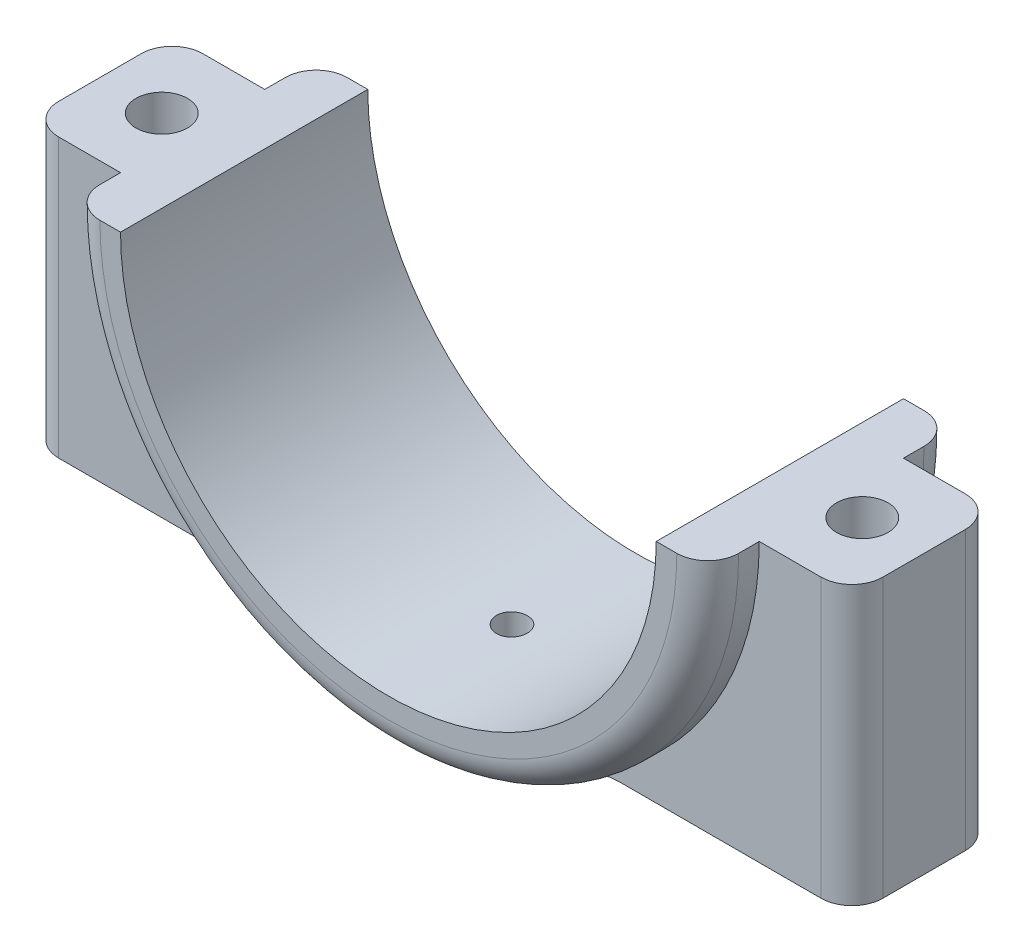
ISO-10303-21;
HEADER;
FILE_DESCRIPTION(('STEP AP214'),'2;1');
FILE_NAME('part.step','',(''),(''),'','','');
FILE_SCHEMA(('AUTOMOTIVE_DESIGN { 1 0 10303 214 1 1 1 1 }'));
ENDSEC;
DATA;
#1=APPLICATION_CONTEXT('core data for automotive mechanical design processes');
#2=APPLICATION_PROTOCOL_DEFINITION('international standard','automotive_design',2000,#1);
#3=PRODUCT_CONTEXT('',#1,'mechanical');
#4=PRODUCT('Part','Part','',(#3));
#5=PRODUCT_RELATED_PRODUCT_CATEGORY('part','',(#4));
#6=PRODUCT_DEFINITION_FORMATION('','',#4);
#7=PRODUCT_DEFINITION_CONTEXT('part definition',#1,'design');
#8=PRODUCT_DEFINITION('design','',#6,#7);
#9=PRODUCT_DEFINITION_SHAPE('','',#8);
#10=(LENGTH_UNIT() NAMED_UNIT(*) SI_UNIT(.MILLI.,.METRE.));
#11=(NAMED_UNIT(*) PLANE_ANGLE_UNIT() SI_UNIT($,.RADIAN.));
#12=(NAMED_UNIT(*) SI_UNIT($,.STERADIAN.) SOLID_ANGLE_UNIT());
#13=UNCERTAINTY_MEASURE_WITH_UNIT(LENGTH_MEASURE(1.E-05),#10,'distance_accuracy_value','');
#14=(GEOMETRIC_REPRESENTATION_CONTEXT(3) GLOBAL_UNCERTAINTY_ASSIGNED_CONTEXT((#13)) GLOBAL_UNIT_ASSIGNED_CONTEXT((#10,
#11,#12)) REPRESENTATION_CONTEXT('',''));
#15=CARTESIAN_POINT('',(0.,0.,0.));
#16=DIRECTION('',(0.,0.,1.));
#17=DIRECTION('',(1.,0.,0.));
#18=AXIS2_PLACEMENT_3D('',#15,#16,#17);
#19=CARTESIAN_POINT('',(15.2315462117278,-27.,12.));
#20=DIRECTION('',(0.,1.,0.));
#21=DIRECTION('',(-1.,0.,0.));
#22=AXIS2_PLACEMENT_3D('',#19,#20,#21);
#23=PLANE('',#22);
#24=DIRECTION('',(1.,0.,0.));
#25=VECTOR('',#24,1.);
#26=CARTESIAN_POINT('',(15.2315462117278,-27.,7.));
#27=LINE('',#26,#25);
#28=CARTESIAN_POINT('',(17.6635217326557,-27.,7.));
#29=VERTEX_POINT('',#28);
#30=CARTESIAN_POINT('',(37.,-27.,7.));
#31=VERTEX_POINT('',#30);
#32=EDGE_CURVE('E243',#29,#31,#27,.T.);
#33=ORIENTED_EDGE('',*,*,#32,.F.);
#34=DIRECTION('',(0.,0.,1.));
#35=VECTOR('',#34,1.);
#36=CARTESIAN_POINT('',(17.6635217326557,-27.,-7.));
#37=LINE('',#36,#35);
#38=CARTESIAN_POINT('',(17.6635217326557,-27.,-7.));
#39=VERTEX_POINT('',#38);
#40=EDGE_CURVE('E386',#29,#39,#37,.F.);
#41=ORIENTED_EDGE('',*,*,#40,.T.);
#42=DIRECTION('',(1.,0.,0.));
#43=VECTOR('',#42,1.);
#44=CARTESIAN_POINT('',(15.2315462117278,-27.,-7.));
#45=LINE('',#44,#43);
#46=CARTESIAN_POINT('',(37.,-27.,-7.));
#47=VERTEX_POINT('',#46);
#48=EDGE_CURVE('E193',#39,#47,#45,.T.);
#49=ORIENTED_EDGE('',*,*,#48,.T.);
#50=CARTESIAN_POINT('',(37.,-27.,-4.));
#51=DIRECTION('',(0.,1.,0.));
#52=DIRECTION('',(-1.,0.,0.));
#53=AXIS2_PLACEMENT_3D('',#50,#51,#52);
#54=CIRCLE('',#53,3.);
#55=CARTESIAN_POINT('',(40.,-27.,-4.));
#56=VERTEX_POINT('',#55);
#57=EDGE_CURVE('E366',#47,#56,#54,.F.);
#58=ORIENTED_EDGE('',*,*,#57,.T.);
#59=DIRECTION('',(0.,0.,-1.));
#60=VECTOR('',#59,1.);
#61=CARTESIAN_POINT('',(40.,-27.,12.));
#62=LINE('',#61,#60);
#63=CARTESIAN_POINT('',(40.,-27.,4.));
#64=VERTEX_POINT('',#63);
#65=EDGE_CURVE('E286',#64,#56,#62,.T.);
#66=ORIENTED_EDGE('',*,*,#65,.F.);
#67=CARTESIAN_POINT('',(37.,-27.,4.));
#68=DIRECTION('',(0.,1.,0.));
#69=DIRECTION('',(-1.,0.,0.));
#70=AXIS2_PLACEMENT_3D('',#67,#68,#69);
#71=CIRCLE('',#70,3.);
#72=EDGE_CURVE('E362',#64,#31,#71,.F.);
#73=ORIENTED_EDGE('',*,*,#72,.T.);
#74=EDGE_LOOP('',(#33,#41,#49,#58,#66,#73));
#75=FACE_BOUND('',#74,.T.);
#76=CARTESIAN_POINT('',(34.,-27.,0.));
#77=DIRECTION('',(0.,1.,0.));
#78=DIRECTION('',(-1.,0.,0.));
#79=AXIS2_PLACEMENT_3D('',#76,#77,#78);
#80=CIRCLE('',#79,2.5);
#81=CARTESIAN_POINT('',(31.5,-27.,0.));
#82=VERTEX_POINT('',#81);
#83=EDGE_CURVE('E414',#82,#82,#80,.F.);
#84=ORIENTED_EDGE('',*,*,#83,.F.);
#85=EDGE_LOOP('',(#84));
#86=FACE_BOUND('',#85,.T.);
#87=ADVANCED_FACE('F41',(#75,#86),#23,.F.);
#88=CARTESIAN_POINT('',(26.,0.,12.));
#89=DIRECTION('',(0.,-1.,0.));
#90=DIRECTION('',(0.,0.,-1.));
#91=AXIS2_PLACEMENT_3D('',#88,#89,#90);
#92=PLANE('',#91);
#93=DIRECTION('',(0.,0.,-1.));
#94=VECTOR('',#93,1.);
#95=CARTESIAN_POINT('',(31.,0.,-7.));
#96=LINE('',#95,#94);
#97=CARTESIAN_POINT('',(31.,0.,-7.));
#98=VERTEX_POINT('',#97);
#99=CARTESIAN_POINT('',(31.,0.,-9.));
#100=VERTEX_POINT('',#99);
#101=EDGE_CURVE('E186',#98,#100,#96,.T.);
#102=ORIENTED_EDGE('',*,*,#101,.T.);
#103=CARTESIAN_POINT('',(28.,0.,-9.));
#104=DIRECTION('',(0.,-1.,0.));
#105=DIRECTION('',(0.,0.,-1.));
#106=AXIS2_PLACEMENT_3D('',#103,#104,#105);
#107=CIRCLE('',#106,3.);
#108=CARTESIAN_POINT('',(28.,0.,-12.));
#109=VERTEX_POINT('',#108);
#110=EDGE_CURVE('E314',#100,#109,#107,.F.);
#111=ORIENTED_EDGE('',*,*,#110,.T.);
#112=DIRECTION('',(-1.,0.,0.));
#113=VECTOR('',#112,1.);
#114=CARTESIAN_POINT('',(26.,0.,-12.));
#115=LINE('',#114,#113);
#116=CARTESIAN_POINT('',(26.,0.,-12.));
#117=VERTEX_POINT('',#116);
#118=EDGE_CURVE('E237',#109,#117,#115,.T.);
#119=ORIENTED_EDGE('',*,*,#118,.T.);
#120=DIRECTION('',(0.,0.,-1.));
#121=VECTOR('',#120,1.);
#122=CARTESIAN_POINT('',(26.,0.,12.));
#123=LINE('',#122,#121);
#124=CARTESIAN_POINT('',(26.,0.,12.));
#125=VERTEX_POINT('',#124);
#126=EDGE_CURVE('E279',#125,#117,#123,.T.);
#127=ORIENTED_EDGE('',*,*,#126,.F.);
#128=DIRECTION('',(-1.,0.,0.));
#129=VECTOR('',#128,1.);
#130=CARTESIAN_POINT('',(26.,0.,12.));
#131=LINE('',#130,#129);
#132=CARTESIAN_POINT('',(28.,0.,12.));
#133=VERTEX_POINT('',#132);
#134=EDGE_CURVE('E276',#133,#125,#131,.T.);
#135=ORIENTED_EDGE('',*,*,#134,.F.);
#136=CARTESIAN_POINT('',(28.,0.,9.));
#137=DIRECTION('',(0.,-1.,0.));
#138=DIRECTION('',(0.,0.,-1.));
#139=AXIS2_PLACEMENT_3D('',#136,#137,#138);
#140=CIRCLE('',#139,3.);
#141=CARTESIAN_POINT('',(31.,0.,9.));
#142=VERTEX_POINT('',#141);
#143=EDGE_CURVE('E311',#133,#142,#140,.F.);
#144=ORIENTED_EDGE('',*,*,#143,.T.);
#145=DIRECTION('',(0.,0.,1.));
#146=VECTOR('',#145,1.);
#147=CARTESIAN_POINT('',(31.,0.,7.));
#148=LINE('',#147,#146);
#149=CARTESIAN_POINT('',(31.,0.,7.));
#150=VERTEX_POINT('',#149);
#151=EDGE_CURVE('E249',#150,#142,#148,.T.);
#152=ORIENTED_EDGE('',*,*,#151,.F.);
#153=DIRECTION('',(-1.,0.,0.));
#154=VECTOR('',#153,1.);
#155=CARTESIAN_POINT('',(40.,0.,7.));
#156=LINE('',#155,#154);
#157=CARTESIAN_POINT('',(37.,0.,7.));
#158=VERTEX_POINT('',#157);
#159=EDGE_CURVE('E246',#158,#150,#156,.T.);
#160=ORIENTED_EDGE('',*,*,#159,.F.);
#161=CARTESIAN_POINT('',(37.,0.,4.));
#162=DIRECTION('',(0.,-1.,0.));
#163=DIRECTION('',(0.,0.,-1.));
#164=AXIS2_PLACEMENT_3D('',#161,#162,#163);
#165=CIRCLE('',#164,3.);
#166=CARTESIAN_POINT('',(40.,0.,4.));
#167=VERTEX_POINT('',#166);
#168=EDGE_CURVE('E306',#158,#167,#165,.F.);
#169=ORIENTED_EDGE('',*,*,#168,.T.);
#170=DIRECTION('',(0.,0.,-1.));
#171=VECTOR('',#170,1.);
#172=CARTESIAN_POINT('',(40.,0.,12.));
#173=LINE('',#172,#171);
#174=CARTESIAN_POINT('',(40.,0.,-4.));
#175=VERTEX_POINT('',#174);
#176=EDGE_CURVE('E283',#167,#175,#173,.T.);
#177=ORIENTED_EDGE('',*,*,#176,.T.);
#178=CARTESIAN_POINT('',(37.,0.,-4.));
#179=DIRECTION('',(0.,-1.,0.));
#180=DIRECTION('',(0.,0.,-1.));
#181=AXIS2_PLACEMENT_3D('',#178,#179,#180);
#182=CIRCLE('',#181,3.);
#183=CARTESIAN_POINT('',(37.,0.,-7.));
#184=VERTEX_POINT('',#183);
#185=EDGE_CURVE('E188',#175,#184,#182,.F.);
#186=ORIENTED_EDGE('',*,*,#185,.T.);
#187=DIRECTION('',(-1.,0.,0.));
#188=VECTOR('',#187,1.);
#189=CARTESIAN_POINT('',(40.,0.,-7.));
#190=LINE('',#189,#188);
#191=EDGE_CURVE('E181',#184,#98,#190,.T.);
#192=ORIENTED_EDGE('',*,*,#191,.T.);
#193=EDGE_LOOP('',(#102,#111,#119,#127,#135,#144,#152,#160,#169,#177,#186,#192));
#194=FACE_BOUND('',#193,.T.);
#195=CARTESIAN_POINT('',(34.,0.,0.));
#196=DIRECTION('',(0.,-1.,0.));
#197=DIRECTION('',(0.,0.,1.));
#198=AXIS2_PLACEMENT_3D('',#195,#196,#197);
#199=CIRCLE('',#198,2.5);
#200=CARTESIAN_POINT('',(34.,0.,2.5));
#201=VERTEX_POINT('',#200);
#202=EDGE_CURVE('E410',#201,#201,#199,.T.);
#203=ORIENTED_EDGE('',*,*,#202,.T.);
#204=EDGE_LOOP('',(#203));
#205=FACE_BOUND('',#204,.T.);
#206=ADVANCED_FACE('F183',(#194,#205),#92,.F.);
#207=CARTESIAN_POINT('',(40.,0.,12.));
#208=DIRECTION('',(-1.,0.,0.));
#209=DIRECTION('',(0.,-1.,0.));
#210=AXIS2_PLACEMENT_3D('',#207,#208,#209);
#211=PLANE('',#210);
#212=ORIENTED_EDGE('',*,*,#65,.T.);
#213=DIRECTION('',(0.,1.,0.));
#214=VECTOR('',#213,1.);
#215=CARTESIAN_POINT('',(40.,0.,-4.));
#216=LINE('',#215,#214);
#217=EDGE_CURVE('E355',#56,#175,#216,.T.);
#218=ORIENTED_EDGE('',*,*,#217,.T.);
#219=ORIENTED_EDGE('',*,*,#176,.F.);
#220=DIRECTION('',(0.,1.,0.));
#221=VECTOR('',#220,1.);
#222=CARTESIAN_POINT('',(40.,-27.,4.));
#223=LINE('',#222,#221);
#224=EDGE_CURVE('E352',#167,#64,#223,.F.);
#225=ORIENTED_EDGE('',*,*,#224,.T.);
#226=EDGE_LOOP('',(#212,#218,#219,#225));
#227=FACE_BOUND('',#226,.T.);
#228=ADVANCED_FACE('F438',(#227),#211,.F.);
#229=CARTESIAN_POINT('',(-40.,0.,12.));
#230=DIRECTION('',(1.,0.,0.));
#231=DIRECTION('',(0.,1.,0.));
#232=AXIS2_PLACEMENT_3D('',#229,#230,#231);
#233=PLANE('',#232);
#234=DIRECTION('',(0.,0.,-1.));
#235=VECTOR('',#234,1.);
#236=CARTESIAN_POINT('',(-40.,0.,12.));
#237=LINE('',#236,#235);
#238=CARTESIAN_POINT('',(-40.,0.,4.));
#239=VERTEX_POINT('',#238);
#240=CARTESIAN_POINT('',(-40.,0.,-4.));
#241=VERTEX_POINT('',#240);
#242=EDGE_CURVE('E294',#239,#241,#237,.T.);
#243=ORIENTED_EDGE('',*,*,#242,.T.);
#244=DIRECTION('',(0.,-1.,0.));
#245=VECTOR('',#244,1.);
#246=CARTESIAN_POINT('',(-40.,-27.,-4.));
#247=LINE('',#246,#245);
#248=CARTESIAN_POINT('',(-40.,-27.,-4.));
#249=VERTEX_POINT('',#248);
#250=EDGE_CURVE('E339',#241,#249,#247,.T.);
#251=ORIENTED_EDGE('',*,*,#250,.T.);
#252=DIRECTION('',(0.,0.,-1.));
#253=VECTOR('',#252,1.);
#254=CARTESIAN_POINT('',(-40.,-27.,12.));
#255=LINE('',#254,#253);
#256=CARTESIAN_POINT('',(-40.,-27.,4.));
#257=VERTEX_POINT('',#256);
#258=EDGE_CURVE('E290',#257,#249,#255,.T.);
#259=ORIENTED_EDGE('',*,*,#258,.F.);
#260=DIRECTION('',(0.,-1.,0.));
#261=VECTOR('',#260,1.);
#262=CARTESIAN_POINT('',(-40.,0.,4.));
#263=LINE('',#262,#261);
#264=EDGE_CURVE('E336',#257,#239,#263,.F.);
#265=ORIENTED_EDGE('',*,*,#264,.T.);
#266=EDGE_LOOP('',(#243,#251,#259,#265));
#267=FACE_BOUND('',#266,.T.);
#268=ADVANCED_FACE('F507',(#267),#233,.F.);
#269=CARTESIAN_POINT('',(-40.,-27.,12.));
#270=DIRECTION('',(0.,1.,0.));
#271=DIRECTION('',(0.,0.,1.));
#272=AXIS2_PLACEMENT_3D('',#269,#270,#271);
#273=PLANE('',#272);
#274=CARTESIAN_POINT('',(-34.,-27.,0.));
#275=DIRECTION('',(0.,1.,0.));
#276=DIRECTION('',(0.,0.,1.));
#277=AXIS2_PLACEMENT_3D('',#274,#275,#276);
#278=CIRCLE('',#277,2.5);
#279=CARTESIAN_POINT('',(-34.,-27.,2.5));
#280=VERTEX_POINT('',#279);
#281=EDGE_CURVE('E204',#280,#280,#278,.T.);
#282=ORIENTED_EDGE('',*,*,#281,.T.);
#283=EDGE_LOOP('',(#282));
#284=FACE_BOUND('',#283,.T.);
#285=DIRECTION('',(1.,0.,0.));
#286=VECTOR('',#285,1.);
#287=CARTESIAN_POINT('',(-40.,-27.,-7.));
#288=LINE('',#287,#286);
#289=CARTESIAN_POINT('',(-37.,-27.,-7.));
#290=VERTEX_POINT('',#289);
#291=CARTESIAN_POINT('',(-17.6635217326557,-27.,-7.));
#292=VERTEX_POINT('',#291);
#293=EDGE_CURVE('E223',#290,#292,#288,.T.);
#294=ORIENTED_EDGE('',*,*,#293,.T.);
#295=DIRECTION('',(0.,0.,1.));
#296=VECTOR('',#295,1.);
#297=CARTESIAN_POINT('',(-17.6635217326557,-27.,7.));
#298=LINE('',#297,#296);
#299=CARTESIAN_POINT('',(-17.6635217326557,-27.,7.));
#300=VERTEX_POINT('',#299);
#301=EDGE_CURVE('E58',#292,#300,#298,.T.);
#302=ORIENTED_EDGE('',*,*,#301,.T.);
#303=DIRECTION('',(1.,0.,0.));
#304=VECTOR('',#303,1.);
#305=CARTESIAN_POINT('',(-40.,-27.,7.));
#306=LINE('',#305,#304);
#307=CARTESIAN_POINT('',(-37.,-27.,7.));
#308=VERTEX_POINT('',#307);
#309=EDGE_CURVE('E261',#308,#300,#306,.T.);
#310=ORIENTED_EDGE('',*,*,#309,.F.);
#311=CARTESIAN_POINT('',(-37.,-27.,4.));
#312=DIRECTION('',(0.,1.,0.));
#313=DIRECTION('',(0.,0.,1.));
#314=AXIS2_PLACEMENT_3D('',#311,#312,#313);
#315=CIRCLE('',#314,3.);
#316=EDGE_CURVE('E343',#308,#257,#315,.F.);
#317=ORIENTED_EDGE('',*,*,#316,.T.);
#318=ORIENTED_EDGE('',*,*,#258,.T.);
#319=CARTESIAN_POINT('',(-37.,-27.,-4.));
#320=DIRECTION('',(0.,1.,0.));
#321=DIRECTION('',(0.,0.,1.));
#322=AXIS2_PLACEMENT_3D('',#319,#320,#321);
#323=CIRCLE('',#322,3.);
#324=EDGE_CURVE('E346',#249,#290,#323,.F.);
#325=ORIENTED_EDGE('',*,*,#324,.T.);
#326=EDGE_LOOP('',(#294,#302,#310,#317,#318,#325));
#327=FACE_BOUND('',#326,.T.);
#328=ADVANCED_FACE('F552',(#284,#327),#273,.F.);
#329=CARTESIAN_POINT('',(0.,0.,12.));
#330=DIRECTION('',(0.,0.,-1.));
#331=DIRECTION('',(-1.,0.,0.));
#332=AXIS2_PLACEMENT_3D('',#329,#330,#331);
#333=CYLINDRICAL_SURFACE('',#332,26.);
#334=CARTESIAN_POINT('',(0.,-26.,1.5));
#335=CARTESIAN_POINT('',(-0.0841805329562701,-25.9999994232652,1.49999629135537));
#336=CARTESIAN_POINT('',(-0.168420319175694,-25.9995867966062,1.49288983050414));
#337=CARTESIAN_POINT('',(-0.334574733472835,-25.9979804159514,1.46464224952499));
#338=CARTESIAN_POINT('',(-0.41648652456529,-25.9967857482195,1.44348471171351));
#339=CARTESIAN_POINT('',(-0.575554082497933,-25.9937504620819,1.3877438977495));
#340=CARTESIAN_POINT('',(-0.652712299121072,-25.9919101797272,1.35316760524497));
#341=CARTESIAN_POINT('',(-0.800109182111021,-25.9877907595835,1.27158185774618));
#342=CARTESIAN_POINT('',(-0.870349448005788,-25.9855117236022,1.22457528611408));
#343=CARTESIAN_POINT('',(-1.00202817818701,-25.9807677473045,1.11939613718608));
#344=CARTESIAN_POINT('',(-1.06345650751792,-25.9783025978251,1.06121087986589));
#345=CARTESIAN_POINT('',(-1.17568107104939,-25.9734660237862,0.93535189256865));
#346=CARTESIAN_POINT('',(-1.22647686510814,-25.97109460311,0.86767776998642));
#347=CARTESIAN_POINT('',(-1.31602460276945,-25.9667113410899,0.724706068464687));
#348=CARTESIAN_POINT('',(-1.35476829307387,-25.9646997465544,0.649403312002849));
#349=CARTESIAN_POINT('',(-1.41905917809215,-25.9612656384867,0.493348262140617));
#350=CARTESIAN_POINT('',(-1.4446064975278,-25.9598431193869,0.412596020252655));
#351=CARTESIAN_POINT('',(-1.48175175962222,-25.9577495380438,0.248030470151698));
#352=CARTESIAN_POINT('',(-1.49336534790163,-25.9570776330248,0.164220704316902));
#353=CARTESIAN_POINT('',(-1.50236176890477,-25.9565585240932,-0.00416121027433815));
#354=CARTESIAN_POINT('',(-1.49974474270827,-25.9567113120047,-0.08873335146443));
#355=CARTESIAN_POINT('',(-1.48036722335147,-25.9578235763576,-0.25613282495506));
#356=CARTESIAN_POINT('',(-1.46362364948965,-25.9587820877828,-0.338962123070258));
#357=CARTESIAN_POINT('',(-1.41649455715691,-25.9613962548023,-0.500632490861998));
#358=CARTESIAN_POINT('',(-1.38610896682727,-25.9630519140687,-0.579473539528182));
#359=CARTESIAN_POINT('',(-1.31253912174372,-25.9668748958775,-0.730983822115165));
#360=CARTESIAN_POINT('',(-1.26934717602174,-25.9690425257286,-0.803649313413986));
#361=CARTESIAN_POINT('',(-1.17139626514012,-25.9736448466155,-0.940704852008894));
#362=CARTESIAN_POINT('',(-1.1166371898198,-25.9760795401945,-1.00509482048285));
#363=CARTESIAN_POINT('',(-0.997011060352408,-25.980945885219,-1.12386997241865));
#364=CARTESIAN_POINT('',(-0.932129360039576,-25.983377527028,-1.17824040627064));
#365=CARTESIAN_POINT('',(-0.79415113051681,-25.9879603013497,-1.27531938878724));
#366=CARTESIAN_POINT('',(-0.721054598813545,-25.9901114337774,-1.31802793391226));
#367=CARTESIAN_POINT('',(-0.568712832225706,-25.9938909128415,-1.39056948427948));
#368=CARTESIAN_POINT('',(-0.489467339345769,-25.9955192375275,-1.42040194892785));
#369=CARTESIAN_POINT('',(-0.32708106477655,-25.9980692970663,-1.46633473870553));
#370=CARTESIAN_POINT('',(-0.243940321874843,-25.9989910389534,-1.4824352005428));
#371=CARTESIAN_POINT('',(-0.0762516098963811,-26.0000231550308,-1.50042871546328));
#372=CARTESIAN_POINT('',(0.00829416374426765,-26.0001346940239,-1.50234216484281));
#373=CARTESIAN_POINT('',(0.176505521707528,-25.9995369306728,-1.49196060479445));
#374=CARTESIAN_POINT('',(0.260171109922139,-25.9988276319596,-1.47966565821983));
#375=CARTESIAN_POINT('',(0.424189805998086,-25.9966688089287,-1.44123319997977));
#376=CARTESIAN_POINT('',(0.504545109369873,-25.9952197840552,-1.4151050277126));
#377=CARTESIAN_POINT('',(0.659729954588885,-25.9917445779571,-1.34975727906617));
#378=CARTESIAN_POINT('',(0.734559454047617,-25.9897183923058,-1.31053760227459));
#379=CARTESIAN_POINT('',(0.876662062309669,-25.9853137409144,-1.22006810277243));
#380=CARTESIAN_POINT('',(0.943926472874837,-25.9829348768066,-1.16880463721188));
#381=CARTESIAN_POINT('',(1.06890199379619,-25.9780939964604,-1.0557226302678));
#382=CARTESIAN_POINT('',(1.1266130235903,-25.975631979521,-0.993903999883256));
#383=CARTESIAN_POINT('',(1.23091249723968,-25.9708989291175,-0.861378573816093));
#384=CARTESIAN_POINT('',(1.27748772359287,-25.9686281246603,-0.790661366473544));
#385=CARTESIAN_POINT('',(1.35810311139776,-25.9645372030828,-0.642398628960878));
#386=CARTESIAN_POINT('',(1.39214334084632,-25.9627170835177,-0.564853135834047));
#387=CARTESIAN_POINT('',(1.44669950357392,-25.9597344312014,-0.405183619903971));
#388=CARTESIAN_POINT('',(1.46722379982346,-25.9585714918839,-0.323062462474262));
#389=CARTESIAN_POINT('',(1.49419281569377,-25.9570332107582,-0.156532814129689));
#390=CARTESIAN_POINT('',(1.5006376504293,-25.9566578625106,-0.0721243419217995));
#391=CARTESIAN_POINT('',(1.49926370789809,-25.9567372474329,0.0964524153222931));
#392=CARTESIAN_POINT('',(1.49146571519202,-25.9571907710306,0.1806208711181));
#393=CARTESIAN_POINT('',(1.4618705150865,-25.9588742293202,0.346451335438427));
#394=CARTESIAN_POINT('',(1.44007328173983,-25.9601041654512,0.428113339317009));
#395=CARTESIAN_POINT('',(1.38310286535193,-25.9632015502146,0.586616399328704));
#396=CARTESIAN_POINT('',(1.3479296890203,-25.9650689985273,0.663457457880063));
#397=CARTESIAN_POINT('',(1.26520891598216,-25.9692309066721,0.81014582355331));
#398=CARTESIAN_POINT('',(1.21766166405776,-25.9715253546061,0.879993325463417));
#399=CARTESIAN_POINT('',(1.11146632504135,-25.9762865607587,1.01081677185677));
#400=CARTESIAN_POINT('',(1.05280337946241,-25.978753546794,1.07178064628148));
#401=CARTESIAN_POINT('',(0.926058699105491,-25.9835799734581,1.18301532539504));
#402=CARTESIAN_POINT('',(0.857974658251974,-25.9859393875671,1.23328350434606));
#403=CARTESIAN_POINT('',(0.714252874919137,-25.990286914298,1.32173129007643));
#404=CARTESIAN_POINT('',(0.6386067443727,-25.9922746074246,1.35989727262968));
#405=CARTESIAN_POINT('',(0.48202442270714,-25.9956488541695,1.42294045445959));
#406=CARTESIAN_POINT('',(0.401094575199689,-25.9970361139297,1.44783327172928));
#407=CARTESIAN_POINT('',(0.266388680269865,-25.9986882490136,1.47712915643839));
#408=CARTESIAN_POINT('',(0.21348411139245,-25.999177979505,1.48569469045444));
#409=CARTESIAN_POINT('',(0.107061018201249,-25.9998340382248,1.49713128836058));
#410=CARTESIAN_POINT('',(0.0535424946001201,-26.0000003668285,1.50000235885992));
#411=CARTESIAN_POINT('',(0.,-26.,1.5));
#412=B_SPLINE_CURVE_WITH_KNOTS('',3,(#334,#335,#336,#337,#338,#339,#340,#341,#342,#343,#344,
#345,#346,#347,#348,#349,#350,#351,#352,#353,#354,#355,#356,#357,#358,#359,#360,#361,#362,#363,
#364,#365,#366,#367,#368,#369,#370,#371,#372,#373,#374,#375,#376,#377,#378,#379,#380,#381,#382,
#383,#384,#385,#386,#387,#388,#389,#390,#391,#392,#393,#394,#395,#396,#397,#398,#399,#400,#401,
#402,#403,#404,#405,#406,#407,#408,#409,#410,#411),.UNSPECIFIED.,.T.,.F.,(4,2,2,2,2,2,2,2,2,2,2,
2,2,2,2,2,2,2,2,2,2,2,2,2,2,2,2,2,2,2,2,2,2,2,2,2,2,2,4),(0.,0.25234614185918,0.504987652199548,
0.75749785389972,1.00994953393219,1.26268927979461,1.51543948594118,1.76836239669215,
2.02128291696969,2.27391917648434,2.52655293141283,2.77888453693176,3.0312174716116,
3.2837022550385,3.53618944313695,3.78904539555262,4.04190142471429,4.29476806883887,
4.54763219553833,4.80013271548406,5.05263211845455,5.30496126533429,5.5572923476322,
5.80991065317838,6.06253108890428,6.31544989707479,6.56836733325132,6.82112812960389,
7.07388685935692,7.32627703291011,7.57866767426323,7.83105818901302,8.08344167209274,
8.33616493015574,8.58895015906783,8.84201896258598,9.0947893295381,9.25529268043359,
9.41579584504143),.UNSPECIFIED.);
#413=CARTESIAN_POINT('',(0.,-26.,1.5));
#414=VERTEX_POINT('',#413);
#415=EDGE_CURVE('E403',#414,#414,#412,.T.);
#416=ORIENTED_EDGE('',*,*,#415,.T.);
#417=EDGE_LOOP('',(#416));
#418=FACE_BOUND('',#417,.T.);
#419=ORIENTED_EDGE('',*,*,#126,.T.);
#420=CARTESIAN_POINT('',(0.,0.,-12.));
#421=DIRECTION('',(0.,0.,-1.));
#422=DIRECTION('',(1.,0.,0.));
#423=AXIS2_PLACEMENT_3D('',#420,#421,#422);
#424=CIRCLE('',#423,26.);
#425=CARTESIAN_POINT('',(-26.,0.,-12.));
#426=VERTEX_POINT('',#425);
#427=EDGE_CURVE('E229',#117,#426,#424,.T.);
#428=ORIENTED_EDGE('',*,*,#427,.T.);
#429=DIRECTION('',(0.,0.,-1.));
#430=VECTOR('',#429,1.);
#431=CARTESIAN_POINT('',(-26.,0.,12.));
#432=LINE('',#431,#430);
#433=CARTESIAN_POINT('',(-26.,0.,12.));
#434=VERTEX_POINT('',#433);
#435=EDGE_CURVE('E298',#434,#426,#432,.T.);
#436=ORIENTED_EDGE('',*,*,#435,.F.);
#437=CARTESIAN_POINT('',(0.,0.,12.));
#438=DIRECTION('',(0.,0.,-1.));
#439=DIRECTION('',(1.,0.,0.));
#440=AXIS2_PLACEMENT_3D('',#437,#438,#439);
#441=CIRCLE('',#440,26.);
#442=EDGE_CURVE('E268',#125,#434,#441,.T.);
#443=ORIENTED_EDGE('',*,*,#442,.F.);
#444=EDGE_LOOP('',(#419,#428,#436,#443));
#445=FACE_BOUND('',#444,.T.);
#446=ADVANCED_FACE('F43',(#418,#445),#333,.F.);
#447=CARTESIAN_POINT('',(-40.,0.,12.));
#448=DIRECTION('',(0.,-1.,0.));
#449=DIRECTION('',(0.,0.,-1.));
#450=AXIS2_PLACEMENT_3D('',#447,#448,#449);
#451=PLANE('',#450);
#452=CARTESIAN_POINT('',(-34.,0.,0.));
#453=DIRECTION('',(0.,1.,0.));
#454=DIRECTION('',(0.,0.,1.));
#455=AXIS2_PLACEMENT_3D('',#452,#453,#454);
#456=CIRCLE('',#455,2.5);
#457=CARTESIAN_POINT('',(-34.,0.,2.5));
#458=VERTEX_POINT('',#457);
#459=EDGE_CURVE('E418',#458,#458,#456,.T.);
#460=ORIENTED_EDGE('',*,*,#459,.F.);
#461=EDGE_LOOP('',(#460));
#462=FACE_BOUND('',#461,.T.);
#463=DIRECTION('',(-1.,0.,0.));
#464=VECTOR('',#463,1.);
#465=CARTESIAN_POINT('',(-40.,0.,-12.));
#466=LINE('',#465,#464);
#467=CARTESIAN_POINT('',(-28.,0.,-12.));
#468=VERTEX_POINT('',#467);
#469=EDGE_CURVE('E233',#426,#468,#466,.T.);
#470=ORIENTED_EDGE('',*,*,#469,.T.);
#471=CARTESIAN_POINT('',(-28.,0.,-9.));
#472=DIRECTION('',(0.,-1.,0.));
#473=DIRECTION('',(0.,0.,-1.));
#474=AXIS2_PLACEMENT_3D('',#471,#472,#473);
#475=CIRCLE('',#474,3.);
#476=CARTESIAN_POINT('',(-31.,0.,-9.));
#477=VERTEX_POINT('',#476);
#478=EDGE_CURVE('E329',#468,#477,#475,.F.);
#479=ORIENTED_EDGE('',*,*,#478,.T.);
#480=DIRECTION('',(0.,0.,-1.));
#481=VECTOR('',#480,1.);
#482=CARTESIAN_POINT('',(-31.,0.,-7.));
#483=LINE('',#482,#481);
#484=CARTESIAN_POINT('',(-31.,0.,-7.));
#485=VERTEX_POINT('',#484);
#486=EDGE_CURVE('E226',#485,#477,#483,.T.);
#487=ORIENTED_EDGE('',*,*,#486,.F.);
#488=DIRECTION('',(-1.,0.,0.));
#489=VECTOR('',#488,1.);
#490=CARTESIAN_POINT('',(-31.,0.,-7.));
#491=LINE('',#490,#489);
#492=CARTESIAN_POINT('',(-37.,0.,-7.));
#493=VERTEX_POINT('',#492);
#494=EDGE_CURVE('E216',#485,#493,#491,.T.);
#495=ORIENTED_EDGE('',*,*,#494,.T.);
#496=CARTESIAN_POINT('',(-37.,0.,-4.));
#497=DIRECTION('',(0.,-1.,0.));
#498=DIRECTION('',(0.,0.,-1.));
#499=AXIS2_PLACEMENT_3D('',#496,#497,#498);
#500=CIRCLE('',#499,3.);
#501=EDGE_CURVE('E323',#493,#241,#500,.F.);
#502=ORIENTED_EDGE('',*,*,#501,.T.);
#503=ORIENTED_EDGE('',*,*,#242,.F.);
#504=CARTESIAN_POINT('',(-37.,0.,4.));
#505=DIRECTION('',(0.,-1.,0.));
#506=DIRECTION('',(0.,0.,-1.));
#507=AXIS2_PLACEMENT_3D('',#504,#505,#506);
#508=CIRCLE('',#507,3.);
#509=CARTESIAN_POINT('',(-37.,0.,7.));
#510=VERTEX_POINT('',#509);
#511=EDGE_CURVE('E320',#239,#510,#508,.F.);
#512=ORIENTED_EDGE('',*,*,#511,.T.);
#513=DIRECTION('',(-1.,0.,0.));
#514=VECTOR('',#513,1.);
#515=CARTESIAN_POINT('',(-31.,0.,7.));
#516=LINE('',#515,#514);
#517=CARTESIAN_POINT('',(-31.,0.,7.));
#518=VERTEX_POINT('',#517);
#519=EDGE_CURVE('E257',#518,#510,#516,.T.);
#520=ORIENTED_EDGE('',*,*,#519,.F.);
#521=DIRECTION('',(0.,0.,1.));
#522=VECTOR('',#521,1.);
#523=CARTESIAN_POINT('',(-31.,0.,7.));
#524=LINE('',#523,#522);
#525=CARTESIAN_POINT('',(-31.,0.,9.));
#526=VERTEX_POINT('',#525);
#527=EDGE_CURVE('E264',#518,#526,#524,.T.);
#528=ORIENTED_EDGE('',*,*,#527,.T.);
#529=CARTESIAN_POINT('',(-28.,0.,9.));
#530=DIRECTION('',(0.,-1.,0.));
#531=DIRECTION('',(0.,0.,-1.));
#532=AXIS2_PLACEMENT_3D('',#529,#530,#531);
#533=CIRCLE('',#532,3.);
#534=CARTESIAN_POINT('',(-28.,0.,12.));
#535=VERTEX_POINT('',#534);
#536=EDGE_CURVE('E326',#526,#535,#533,.F.);
#537=ORIENTED_EDGE('',*,*,#536,.T.);
#538=DIRECTION('',(-1.,0.,0.));
#539=VECTOR('',#538,1.);
#540=CARTESIAN_POINT('',(-40.,0.,12.));
#541=LINE('',#540,#539);
#542=EDGE_CURVE('E272',#434,#535,#541,.T.);
#543=ORIENTED_EDGE('',*,*,#542,.F.);
#544=ORIENTED_EDGE('',*,*,#435,.T.);
#545=EDGE_LOOP('',(#470,#479,#487,#495,#502,#503,#512,#520,#528,#537,#543,#544));
#546=FACE_BOUND('',#545,.T.);
#547=ADVANCED_FACE('F487',(#462,#546),#451,.F.);
#548=CARTESIAN_POINT('',(0.,0.,12.));
#549=DIRECTION('',(0.,0.,-1.));
#550=DIRECTION('',(-1.,0.,0.));
#551=AXIS2_PLACEMENT_3D('',#548,#549,#550);
#552=CYLINDRICAL_SURFACE('',#551,31.);
#553=CARTESIAN_POINT('',(0.,-31.,1.5));
#554=CARTESIAN_POINT('',(0.084202792347213,-30.9999995141353,1.49999628267172));
#555=CARTESIAN_POINT('',(0.16846538393463,-30.9996532552646,1.49288607826635));
#556=CARTESIAN_POINT('',(0.334666306521815,-30.9983052478194,1.46462276024114));
#557=CARTESIAN_POINT('',(0.416601776177143,-30.9973027258885,1.44345307816335));
#558=CARTESIAN_POINT('',(0.575716806083685,-30.9947556673606,1.3876781155977));
#559=CARTESIAN_POINT('',(0.652898757466731,-30.9932114059327,1.35307965512768));
#560=CARTESIAN_POINT('',(0.800338424727764,-30.989754816157,1.27143967078801));
#561=CARTESIAN_POINT('',(0.870597775269236,-30.9878425750182,1.22440109416827));
#562=CARTESIAN_POINT('',(1.00228593602068,-30.9838631189523,1.11916597512179));
#563=CARTESIAN_POINT('',(1.06370732933708,-30.9817957760503,1.06096015551694));
#564=CARTESIAN_POINT('',(1.175912884304,-30.9777402237292,0.935061211771744));
#565=CARTESIAN_POINT('',(1.22669661252568,-30.9757520175373,0.867367701245441));
#566=CARTESIAN_POINT('',(1.31620530239942,-30.9720780482436,0.724376578644087));
#567=CARTESIAN_POINT('',(1.35492453624809,-30.9703924289601,0.649075377098863));
#568=CARTESIAN_POINT('',(1.41916837372733,-30.9675152571658,0.493031678664971));
#569=CARTESIAN_POINT('',(1.44469307279057,-30.9663237010814,0.412289221136279));
#570=CARTESIAN_POINT('',(1.4818038666233,-30.9645701698934,0.247722648500629));
#571=CARTESIAN_POINT('',(1.49340096608462,-30.9640076977523,0.163901020401466));
#572=CARTESIAN_POINT('',(1.50236131211673,-30.9635742700934,-0.00450098116969173));
#573=CARTESIAN_POINT('',(1.49972466550413,-30.9637033093863,-0.0890813489429987));
#574=CARTESIAN_POINT('',(1.48030153781623,-30.9646378909971,-0.256525121490327));
#575=CARTESIAN_POINT('',(1.46352694576875,-30.9654428648991,-0.339389908978721));
#576=CARTESIAN_POINT('',(1.41632251806988,-30.9676376904524,-0.501126043058462));
#577=CARTESIAN_POINT('',(1.38589262744842,-30.9690275444582,-0.579997373572531));
#578=CARTESIAN_POINT('',(1.31222780980623,-30.9722361341312,-0.731546033020237));
#579=CARTESIAN_POINT('',(1.26898745946914,-30.9740550513761,-0.804220721786763));
#580=CARTESIAN_POINT('',(1.17093311263252,-30.977916568651,-0.941284248654876));
#581=CARTESIAN_POINT('',(1.11611903992714,-30.9799591701538,-1.00567303219439));
#582=CARTESIAN_POINT('',(0.996406111684985,-30.984040357555,-1.12440618960939));
#583=CARTESIAN_POINT('',(0.931496959677817,-30.9860789371772,-1.17874018280817));
#584=CARTESIAN_POINT('',(0.793472603518237,-30.9899202884063,-1.27574143375514));
#585=CARTESIAN_POINT('',(0.720357397428757,-30.9917230599576,-1.31840868874934));
#586=CARTESIAN_POINT('',(0.567990360982849,-30.994889688708,-1.39086428631198));
#587=CARTESIAN_POINT('',(0.488738359775541,-30.9962535336818,-1.42065227016414));
#588=CARTESIAN_POINT('',(0.326350089454761,-30.9983884188355,-1.46649698471219));
#589=CARTESIAN_POINT('',(0.243213847587594,-30.9991594631729,-1.48255381171107));
#590=CARTESIAN_POINT('',(0.0755071546222431,-31.0000213131359,-1.50046763138586));
#591=CARTESIAN_POINT('',(-0.00906175932715504,-31.0001128066215,-1.50233898302637));
#592=CARTESIAN_POINT('',(-0.177312416363826,-30.9996070690898,-1.49186619809194));
#593=CARTESIAN_POINT('',(-0.260994162194988,-30.9990098402033,-1.47952210549636));
#594=CARTESIAN_POINT('',(-0.425054850717316,-30.9971943722293,-1.44098071994186));
#595=CARTESIAN_POINT('',(-0.505435336299306,-30.995976426895,-1.41478997967182));
#596=CARTESIAN_POINT('',(-0.660659311632056,-30.9930566618195,-1.34930540074958));
#597=CARTESIAN_POINT('',(-0.735502771549003,-30.9913548394712,-1.31001149150302));
#598=CARTESIAN_POINT('',(-0.877594113082684,-30.9876570795363,-1.21939919981785));
#599=CARTESIAN_POINT('',(-0.944835847886493,-30.9856609068986,-1.1680711881436));
#600=CARTESIAN_POINT('',(-1.069753196027,-30.981600053942,-1.05486178073887));
#601=CARTESIAN_POINT('',(-1.12742875167054,-30.9795353732099,-0.992980321365624));
#602=CARTESIAN_POINT('',(-1.23162484946452,-30.9755682593618,-0.860358857446884));
#603=CARTESIAN_POINT('',(-1.27813610398032,-30.9736659621752,-0.789611551312447));
#604=CARTESIAN_POINT('',(-1.35861984062872,-30.9702402602838,-0.641303571456715));
#605=CARTESIAN_POINT('',(-1.39259237474057,-30.9687168540083,-0.563742925981769));
#606=CARTESIAN_POINT('',(-1.44701811019111,-30.9662216887023,-0.404044393253006));
#607=CARTESIAN_POINT('',(-1.4674772410086,-30.9652496877498,-0.32190853071367));
#608=CARTESIAN_POINT('',(-1.49431480708805,-30.9639662597759,-0.15536273788787));
#609=CARTESIAN_POINT('',(-1.50069331556864,-30.9636548293196,-0.0709528194287082));
#610=CARTESIAN_POINT('',(-1.49918787094173,-30.9637277479162,0.0976525227454576));
#611=CARTESIAN_POINT('',(-1.49131853063321,-30.964111384099,0.181848077635793));
#612=CARTESIAN_POINT('',(-1.46157096482106,-30.965529690569,0.34772120738356));
#613=CARTESIAN_POINT('',(-1.43969271249196,-30.9665643621029,0.429398777419027));
#614=CARTESIAN_POINT('',(-1.38255130267945,-30.9691679635807,0.587920601552681));
#615=CARTESIAN_POINT('',(-1.34728802998449,-30.9707368981232,0.664764814041113));
#616=CARTESIAN_POINT('',(-1.26438019462109,-30.9742321397003,0.811442855832791));
#617=CARTESIAN_POINT('',(-1.21673601854694,-30.9761584355758,0.881276903934388));
#618=CARTESIAN_POINT('',(-1.11036684002992,-30.9801535291738,1.01202505090426));
#619=CARTESIAN_POINT('',(-1.05163172409336,-30.9822224558552,1.07293091767903));
#620=CARTESIAN_POINT('',(-0.924753216326256,-30.9862687518801,1.18403664237983));
#621=CARTESIAN_POINT('',(-0.856607512051158,-30.9882460985599,1.23423386115272));
#622=CARTESIAN_POINT('',(-0.712791432696068,-30.9918877101885,1.3225193463518));
#623=CARTESIAN_POINT('',(-0.637114140312011,-30.9935516831903,1.36059634382881));
#624=CARTESIAN_POINT('',(-0.480489523188893,-30.9963746122402,1.42345862680518));
#625=CARTESIAN_POINT('',(-0.39954855684272,-30.9975341650531,1.44825962680302));
#626=CARTESIAN_POINT('',(-0.265086546175709,-30.9989105775063,1.47735387376696));
#627=CARTESIAN_POINT('',(-0.21243662515433,-30.9993173178012,1.48583534461829));
#628=CARTESIAN_POINT('',(-0.106532449423644,-30.9998621826533,1.49715958153611));
#629=CARTESIAN_POINT('',(-0.0532781951953069,-31.0000003074244,1.50000235208995));
#630=CARTESIAN_POINT('',(0.,-31.,1.5));
#631=B_SPLINE_CURVE_WITH_KNOTS('',3,(#553,#554,#555,#556,#557,#558,#559,#560,#561,#562,#563,
#564,#565,#566,#567,#568,#569,#570,#571,#572,#573,#574,#575,#576,#577,#578,#579,#580,#581,#582,
#583,#584,#585,#586,#587,#588,#589,#590,#591,#592,#593,#594,#595,#596,#597,#598,#599,#600,#601,
#602,#603,#604,#605,#606,#607,#608,#609,#610,#611,#612,#613,#614,#615,#616,#617,#618,#619,#620,
#621,#622,#623,#624,#625,#626,#627,#628,#629,#630),.UNSPECIFIED.,.T.,.F.,(4,2,2,2,2,2,2,2,2,2,2,
2,2,2,2,2,2,2,2,2,2,2,2,2,2,2,2,2,2,2,2,2,2,2,2,2,2,2,4),(0.,0.252413893052158,
0.505125773523082,0.757709477845073,1.01023339482665,1.26296801140084,1.51571292357749,
1.76857764807687,2.02144054364531,2.27410351151813,2.52676458329392,2.7792133964486,
3.03166322585737,3.28422008315802,3.53677860344184,3.78959643072694,4.04241431769071,
4.29523924573995,4.54806240059551,4.80062960603607,5.053196030093,5.30564303826078,
5.55809140652848,5.8107424680577,6.06339505325767,6.31625709848695,6.56911809546483,
6.82186806699016,7.0746167242234,7.32710630561693,7.57959637050037,7.83208860874094,
8.08457296384636,8.33728867346245,8.59006659325905,8.84307885505921,9.09579096598644,
9.25550262151986,9.41521414995216),.UNSPECIFIED.);
#632=CARTESIAN_POINT('',(0.,-31.,1.5));
#633=VERTEX_POINT('',#632);
#634=EDGE_CURVE('E377',#633,#633,#631,.T.);
#635=ORIENTED_EDGE('',*,*,#634,.T.);
#636=EDGE_LOOP('',(#635));
#637=FACE_BOUND('',#636,.T.);
#638=CARTESIAN_POINT('',(0.,0.,-7.));
#639=DIRECTION('',(0.,0.,-1.));
#640=DIRECTION('',(1.,0.,0.));
#641=AXIS2_PLACEMENT_3D('',#638,#639,#640);
#642=CIRCLE('',#641,31.);
#643=CARTESIAN_POINT('',(13.3553457003007,-27.9756097560976,-7.));
#644=VERTEX_POINT('',#643);
#645=EDGE_CURVE('E196',#98,#644,#642,.T.);
#646=ORIENTED_EDGE('',*,*,#645,.T.);
#647=DIRECTION('',(0.,0.,-1.));
#648=VECTOR('',#647,1.);
#649=CARTESIAN_POINT('',(13.3553457003007,-27.9756097560976,12.));
#650=LINE('',#649,#648);
#651=CARTESIAN_POINT('',(13.3553457003006,-27.9756097560976,7.));
#652=VERTEX_POINT('',#651);
#653=EDGE_CURVE('E457',#644,#652,#650,.F.);
#654=ORIENTED_EDGE('',*,*,#653,.T.);
#655=CARTESIAN_POINT('',(0.,0.,7.));
#656=DIRECTION('',(0.,0.,-1.));
#657=DIRECTION('',(1.,0.,0.));
#658=AXIS2_PLACEMENT_3D('',#655,#656,#657);
#659=CIRCLE('',#658,31.);
#660=EDGE_CURVE('E240',#150,#652,#659,.T.);
#661=ORIENTED_EDGE('',*,*,#660,.F.);
#662=ORIENTED_EDGE('',*,*,#151,.T.);
#663=CARTESIAN_POINT('',(0.,0.,9.));
#664=DIRECTION('',(0.,0.,1.));
#665=DIRECTION('',(1.,0.,0.));
#666=AXIS2_PLACEMENT_3D('',#663,#664,#665);
#667=CIRCLE('',#666,31.);
#668=EDGE_CURVE('E301',#142,#526,#667,.F.);
#669=ORIENTED_EDGE('',*,*,#668,.T.);
#670=ORIENTED_EDGE('',*,*,#527,.F.);
#671=CARTESIAN_POINT('',(0.,0.,7.));
#672=DIRECTION('',(0.,0.,-1.));
#673=DIRECTION('',(1.,0.,0.));
#674=AXIS2_PLACEMENT_3D('',#671,#672,#673);
#675=CIRCLE('',#674,31.);
#676=CARTESIAN_POINT('',(-13.3553457003006,-27.9756097560976,7.));
#677=VERTEX_POINT('',#676);
#678=EDGE_CURVE('E253',#677,#518,#675,.T.);
#679=ORIENTED_EDGE('',*,*,#678,.F.);
#680=DIRECTION('',(0.,0.,-1.));
#681=VECTOR('',#680,1.);
#682=CARTESIAN_POINT('',(-13.3553457003006,-27.9756097560976,12.));
#683=LINE('',#682,#681);
#684=CARTESIAN_POINT('',(-13.3553457003006,-27.9756097560976,-7.));
#685=VERTEX_POINT('',#684);
#686=EDGE_CURVE('E453',#677,#685,#683,.T.);
#687=ORIENTED_EDGE('',*,*,#686,.T.);
#688=CARTESIAN_POINT('',(0.,0.,-7.));
#689=DIRECTION('',(0.,0.,-1.));
#690=DIRECTION('',(1.,0.,0.));
#691=AXIS2_PLACEMENT_3D('',#688,#689,#690);
#692=CIRCLE('',#691,31.);
#693=EDGE_CURVE('E212',#685,#485,#692,.T.);
#694=ORIENTED_EDGE('',*,*,#693,.T.);
#695=ORIENTED_EDGE('',*,*,#486,.T.);
#696=CARTESIAN_POINT('',(0.,0.,-9.));
#697=DIRECTION('',(0.,0.,-1.));
#698=DIRECTION('',(-1.,0.,0.));
#699=AXIS2_PLACEMENT_3D('',#696,#697,#698);
#700=CIRCLE('',#699,31.);
#701=EDGE_CURVE('E210',#477,#100,#700,.F.);
#702=ORIENTED_EDGE('',*,*,#701,.T.);
#703=ORIENTED_EDGE('',*,*,#101,.F.);
#704=EDGE_LOOP('',(#646,#654,#661,#662,#669,#670,#679,#687,#694,#695,#702,#703));
#705=FACE_BOUND('',#704,.T.);
#706=ADVANCED_FACE('F207',(#637,#705),#552,.T.);
#707=CARTESIAN_POINT('',(0.,0.,12.));
#708=DIRECTION('',(0.,0.,1.));
#709=DIRECTION('',(1.,0.,0.));
#710=AXIS2_PLACEMENT_3D('',#707,#708,#709);
#711=PLANE('',#710);
#712=ORIENTED_EDGE('',*,*,#542,.T.);
#713=CARTESIAN_POINT('',(0.,0.,12.));
#714=DIRECTION('',(0.,0.,1.));
#715=DIRECTION('',(1.,0.,0.));
#716=AXIS2_PLACEMENT_3D('',#713,#714,#715);
#717=CIRCLE('',#716,28.);
#718=EDGE_CURVE('E332',#535,#133,#717,.T.);
#719=ORIENTED_EDGE('',*,*,#718,.T.);
#720=ORIENTED_EDGE('',*,*,#134,.T.);
#721=ORIENTED_EDGE('',*,*,#442,.T.);
#722=EDGE_LOOP('',(#712,#719,#720,#721));
#723=FACE_BOUND('',#722,.T.);
#724=ADVANCED_FACE('F483',(#723),#711,.T.);
#725=CARTESIAN_POINT('',(0.,0.,7.));
#726=DIRECTION('',(0.,0.,1.));
#727=DIRECTION('',(1.,0.,0.));
#728=AXIS2_PLACEMENT_3D('',#725,#726,#727);
#729=PLANE('',#728);
#730=ORIENTED_EDGE('',*,*,#519,.T.);
#731=DIRECTION('',(0.,-1.,0.));
#732=VECTOR('',#731,1.);
#733=CARTESIAN_POINT('',(-37.,-27.,7.));
#734=LINE('',#733,#732);
#735=EDGE_CURVE('E373',#510,#308,#734,.T.);
#736=ORIENTED_EDGE('',*,*,#735,.T.);
#737=ORIENTED_EDGE('',*,*,#309,.T.);
#738=CARTESIAN_POINT('',(-17.6635217326557,-37.,7.));
#739=DIRECTION('',(0.,0.,1.));
#740=DIRECTION('',(1.,0.,0.));
#741=AXIS2_PLACEMENT_3D('',#738,#739,#740);
#742=CIRCLE('',#741,10.);
#743=EDGE_CURVE('E11',#300,#677,#742,.F.);
#744=ORIENTED_EDGE('',*,*,#743,.T.);
#745=ORIENTED_EDGE('',*,*,#678,.T.);
#746=EDGE_LOOP('',(#730,#736,#737,#744,#745));
#747=FACE_BOUND('',#746,.T.);
#748=ADVANCED_FACE('F491',(#747),#729,.T.);
#749=CARTESIAN_POINT('',(0.,0.,7.));
#750=DIRECTION('',(0.,0.,1.));
#751=DIRECTION('',(1.,0.,0.));
#752=AXIS2_PLACEMENT_3D('',#749,#750,#751);
#753=PLANE('',#752);
#754=ORIENTED_EDGE('',*,*,#660,.T.);
#755=CARTESIAN_POINT('',(17.6635217326557,-37.,7.));
#756=DIRECTION('',(0.,0.,1.));
#757=DIRECTION('',(1.,0.,0.));
#758=AXIS2_PLACEMENT_3D('',#755,#756,#757);
#759=CIRCLE('',#758,10.);
#760=EDGE_CURVE('E450',#652,#29,#759,.F.);
#761=ORIENTED_EDGE('',*,*,#760,.T.);
#762=ORIENTED_EDGE('',*,*,#32,.T.);
#763=DIRECTION('',(0.,1.,0.));
#764=VECTOR('',#763,1.);
#765=CARTESIAN_POINT('',(37.,0.,7.));
#766=LINE('',#765,#764);
#767=EDGE_CURVE('E369',#31,#158,#766,.T.);
#768=ORIENTED_EDGE('',*,*,#767,.T.);
#769=ORIENTED_EDGE('',*,*,#159,.T.);
#770=EDGE_LOOP('',(#754,#761,#762,#768,#769));
#771=FACE_BOUND('',#770,.T.);
#772=ADVANCED_FACE('F447',(#771),#753,.T.);
#773=CARTESIAN_POINT('',(0.,0.,-12.));
#774=DIRECTION('',(0.,0.,-1.));
#775=DIRECTION('',(1.,0.,0.));
#776=AXIS2_PLACEMENT_3D('',#773,#774,#775);
#777=PLANE('',#776);
#778=ORIENTED_EDGE('',*,*,#118,.F.);
#779=CARTESIAN_POINT('',(0.,0.,-12.));
#780=DIRECTION('',(0.,0.,-1.));
#781=DIRECTION('',(-1.,0.,0.));
#782=AXIS2_PLACEMENT_3D('',#779,#780,#781);
#783=CIRCLE('',#782,28.);
#784=EDGE_CURVE('E317',#109,#468,#783,.T.);
#785=ORIENTED_EDGE('',*,*,#784,.T.);
#786=ORIENTED_EDGE('',*,*,#469,.F.);
#787=ORIENTED_EDGE('',*,*,#427,.F.);
#788=EDGE_LOOP('',(#778,#785,#786,#787));
#789=FACE_BOUND('',#788,.T.);
#790=ADVANCED_FACE('F515',(#789),#777,.T.);
#791=CARTESIAN_POINT('',(0.,0.,-7.));
#792=DIRECTION('',(0.,0.,-1.));
#793=DIRECTION('',(1.,0.,0.));
#794=AXIS2_PLACEMENT_3D('',#791,#792,#793);
#795=PLANE('',#794);
#796=ORIENTED_EDGE('',*,*,#293,.F.);
#797=DIRECTION('',(0.,-1.,0.));
#798=VECTOR('',#797,1.);
#799=CARTESIAN_POINT('',(-37.,0.,-7.));
#800=LINE('',#799,#798);
#801=EDGE_CURVE('E349',#290,#493,#800,.F.);
#802=ORIENTED_EDGE('',*,*,#801,.T.);
#803=ORIENTED_EDGE('',*,*,#494,.F.);
#804=ORIENTED_EDGE('',*,*,#693,.F.);
#805=CARTESIAN_POINT('',(-17.6635217326557,-37.,-7.));
#806=DIRECTION('',(0.,0.,-1.));
#807=DIRECTION('',(-1.,0.,0.));
#808=AXIS2_PLACEMENT_3D('',#805,#806,#807);
#809=CIRCLE('',#808,10.);
#810=EDGE_CURVE('E51',#685,#292,#809,.F.);
#811=ORIENTED_EDGE('',*,*,#810,.T.);
#812=EDGE_LOOP('',(#796,#802,#803,#804,#811));
#813=FACE_BOUND('',#812,.T.);
#814=ADVANCED_FACE('F518',(#813),#795,.T.);
#815=CARTESIAN_POINT('',(0.,0.,-7.));
#816=DIRECTION('',(0.,0.,-1.));
#817=DIRECTION('',(1.,0.,0.));
#818=AXIS2_PLACEMENT_3D('',#815,#816,#817);
#819=PLANE('',#818);
#820=ORIENTED_EDGE('',*,*,#191,.F.);
#821=DIRECTION('',(0.,1.,0.));
#822=VECTOR('',#821,1.);
#823=CARTESIAN_POINT('',(37.,-27.,-7.));
#824=LINE('',#823,#822);
#825=EDGE_CURVE('E359',#184,#47,#824,.F.);
#826=ORIENTED_EDGE('',*,*,#825,.T.);
#827=ORIENTED_EDGE('',*,*,#48,.F.);
#828=CARTESIAN_POINT('',(17.6635217326557,-37.,-7.));
#829=DIRECTION('',(0.,0.,-1.));
#830=DIRECTION('',(-1.,0.,0.));
#831=AXIS2_PLACEMENT_3D('',#828,#829,#830);
#832=CIRCLE('',#831,10.);
#833=EDGE_CURVE('E199',#39,#644,#832,.F.);
#834=ORIENTED_EDGE('',*,*,#833,.T.);
#835=ORIENTED_EDGE('',*,*,#645,.F.);
#836=EDGE_LOOP('',(#820,#826,#827,#834,#835));
#837=FACE_BOUND('',#836,.T.);
#838=ADVANCED_FACE('F197',(#837),#819,.T.);
#839=CARTESIAN_POINT('',(0.,0.,-9.));
#840=DIRECTION('',(0.,0.,-1.));
#841=DIRECTION('',(-1.,0.,0.));
#842=AXIS2_PLACEMENT_3D('',#839,#840,#841);
#843=TOROIDAL_SURFACE('',#842,28.,3.);
#844=ORIENTED_EDGE('',*,*,#478,.F.);
#845=ORIENTED_EDGE('',*,*,#784,.F.);
#846=ORIENTED_EDGE('',*,*,#110,.F.);
#847=ORIENTED_EDGE('',*,*,#701,.F.);
#848=EDGE_LOOP('',(#844,#845,#846,#847));
#849=FACE_BOUND('',#848,.T.);
#850=ADVANCED_FACE('F524',(#849),#843,.T.);
#851=CARTESIAN_POINT('',(0.,0.,9.));
#852=DIRECTION('',(0.,0.,1.));
#853=DIRECTION('',(1.,0.,0.));
#854=AXIS2_PLACEMENT_3D('',#851,#852,#853);
#855=TOROIDAL_SURFACE('',#854,28.,3.);
#856=ORIENTED_EDGE('',*,*,#536,.F.);
#857=ORIENTED_EDGE('',*,*,#668,.F.);
#858=ORIENTED_EDGE('',*,*,#143,.F.);
#859=ORIENTED_EDGE('',*,*,#718,.F.);
#860=EDGE_LOOP('',(#856,#857,#858,#859));
#861=FACE_BOUND('',#860,.T.);
#862=ADVANCED_FACE('F481',(#861),#855,.T.);
#863=CARTESIAN_POINT('',(-37.,0.,-4.));
#864=DIRECTION('',(0.,1.,0.));
#865=DIRECTION('',(-1.,0.,0.));
#866=AXIS2_PLACEMENT_3D('',#863,#864,#865);
#867=CYLINDRICAL_SURFACE('',#866,3.);
#868=ORIENTED_EDGE('',*,*,#501,.F.);
#869=ORIENTED_EDGE('',*,*,#801,.F.);
#870=ORIENTED_EDGE('',*,*,#324,.F.);
#871=ORIENTED_EDGE('',*,*,#250,.F.);
#872=EDGE_LOOP('',(#868,#869,#870,#871));
#873=FACE_BOUND('',#872,.T.);
#874=ADVANCED_FACE('F530',(#873),#867,.T.);
#875=CARTESIAN_POINT('',(37.,0.,-4.));
#876=DIRECTION('',(0.,-1.,0.));
#877=DIRECTION('',(1.,0.,0.));
#878=AXIS2_PLACEMENT_3D('',#875,#876,#877);
#879=CYLINDRICAL_SURFACE('',#878,3.);
#880=ORIENTED_EDGE('',*,*,#57,.F.);
#881=ORIENTED_EDGE('',*,*,#825,.F.);
#882=ORIENTED_EDGE('',*,*,#185,.F.);
#883=ORIENTED_EDGE('',*,*,#217,.F.);
#884=EDGE_LOOP('',(#880,#881,#882,#883));
#885=FACE_BOUND('',#884,.T.);
#886=ADVANCED_FACE('F435',(#885),#879,.T.);
#887=CARTESIAN_POINT('',(37.,0.,4.));
#888=DIRECTION('',(0.,-1.,0.));
#889=DIRECTION('',(1.,0.,0.));
#890=AXIS2_PLACEMENT_3D('',#887,#888,#889);
#891=CYLINDRICAL_SURFACE('',#890,3.);
#892=ORIENTED_EDGE('',*,*,#72,.F.);
#893=ORIENTED_EDGE('',*,*,#224,.F.);
#894=ORIENTED_EDGE('',*,*,#168,.F.);
#895=ORIENTED_EDGE('',*,*,#767,.F.);
#896=EDGE_LOOP('',(#892,#893,#894,#895));
#897=FACE_BOUND('',#896,.T.);
#898=ADVANCED_FACE('F445',(#897),#891,.T.);
#899=CARTESIAN_POINT('',(-37.,0.,4.));
#900=DIRECTION('',(0.,1.,0.));
#901=DIRECTION('',(-1.,0.,0.));
#902=AXIS2_PLACEMENT_3D('',#899,#900,#901);
#903=CYLINDRICAL_SURFACE('',#902,3.);
#904=ORIENTED_EDGE('',*,*,#511,.F.);
#905=ORIENTED_EDGE('',*,*,#264,.F.);
#906=ORIENTED_EDGE('',*,*,#316,.F.);
#907=ORIENTED_EDGE('',*,*,#735,.F.);
#908=EDGE_LOOP('',(#904,#905,#906,#907));
#909=FACE_BOUND('',#908,.T.);
#910=ADVANCED_FACE('F538',(#909),#903,.T.);
#911=CARTESIAN_POINT('',(-34.,-31.,0.));
#912=DIRECTION('',(0.,1.,0.));
#913=DIRECTION('',(0.,0.,1.));
#914=AXIS2_PLACEMENT_3D('',#911,#912,#913);
#915=CYLINDRICAL_SURFACE('',#914,2.5);
#916=ORIENTED_EDGE('',*,*,#459,.T.);
#917=EDGE_LOOP('',(#916));
#918=FACE_BOUND('',#917,.T.);
#919=ORIENTED_EDGE('',*,*,#281,.F.);
#920=EDGE_LOOP('',(#919));
#921=FACE_BOUND('',#920,.T.);
#922=ADVANCED_FACE('F540',(#918,#921),#915,.F.);
#923=CARTESIAN_POINT('',(34.,-31.,0.));
#924=DIRECTION('',(0.,1.,0.));
#925=DIRECTION('',(0.,0.,1.));
#926=AXIS2_PLACEMENT_3D('',#923,#924,#925);
#927=CYLINDRICAL_SURFACE('',#926,2.5);
#928=ORIENTED_EDGE('',*,*,#202,.F.);
#929=EDGE_LOOP('',(#928));
#930=FACE_BOUND('',#929,.T.);
#931=ORIENTED_EDGE('',*,*,#83,.T.);
#932=EDGE_LOOP('',(#931));
#933=FACE_BOUND('',#932,.T.);
#934=ADVANCED_FACE('F397',(#930,#933),#927,.F.);
#935=CARTESIAN_POINT('',(0.,-31.,0.));
#936=DIRECTION('',(0.,1.,0.));
#937=DIRECTION('',(0.,0.,1.));
#938=AXIS2_PLACEMENT_3D('',#935,#936,#937);
#939=CYLINDRICAL_SURFACE('',#938,1.5);
#940=ORIENTED_EDGE('',*,*,#634,.F.);
#941=EDGE_LOOP('',(#940));
#942=FACE_BOUND('',#941,.T.);
#943=ORIENTED_EDGE('',*,*,#415,.F.);
#944=EDGE_LOOP('',(#943));
#945=FACE_BOUND('',#944,.T.);
#946=ADVANCED_FACE('F391',(#942,#945),#939,.F.);
#947=CARTESIAN_POINT('',(17.6635217326557,-37.,12.));
#948=DIRECTION('',(0.,0.,-1.));
#949=DIRECTION('',(-1.,0.,0.));
#950=AXIS2_PLACEMENT_3D('',#947,#948,#949);
#951=CYLINDRICAL_SURFACE('',#950,10.);
#952=ORIENTED_EDGE('',*,*,#760,.F.);
#953=ORIENTED_EDGE('',*,*,#653,.F.);
#954=ORIENTED_EDGE('',*,*,#833,.F.);
#955=ORIENTED_EDGE('',*,*,#40,.F.);
#956=EDGE_LOOP('',(#952,#953,#954,#955));
#957=FACE_BOUND('',#956,.T.);
#958=ADVANCED_FACE('F396',(#957),#951,.F.);
#959=CARTESIAN_POINT('',(-17.6635217326557,-37.,12.));
#960=DIRECTION('',(0.,0.,-1.));
#961=DIRECTION('',(-1.,0.,0.));
#962=AXIS2_PLACEMENT_3D('',#959,#960,#961);
#963=CYLINDRICAL_SURFACE('',#962,10.);
#964=ORIENTED_EDGE('',*,*,#743,.F.);
#965=ORIENTED_EDGE('',*,*,#301,.F.);
#966=ORIENTED_EDGE('',*,*,#810,.F.);
#967=ORIENTED_EDGE('',*,*,#686,.F.);
#968=EDGE_LOOP('',(#964,#965,#966,#967));
#969=FACE_BOUND('',#968,.T.);
#970=ADVANCED_FACE('F495',(#969),#963,.F.);
#971=CLOSED_SHELL('',(#87,#206,#228,#268,#328,#446,#547,#706,#724,#748,#772,#790,#814,#838,#850,
#862,#874,#886,#898,#910,#922,#934,#946,#958,#970));
#972=MANIFOLD_SOLID_BREP('B2',#971);
#973=ADVANCED_BREP_SHAPE_REPRESENTATION('',(#18,#972),#14);
#974=SHAPE_DEFINITION_REPRESENTATION(#9,#973);
ENDSEC;
END-ISO-10303-21;
